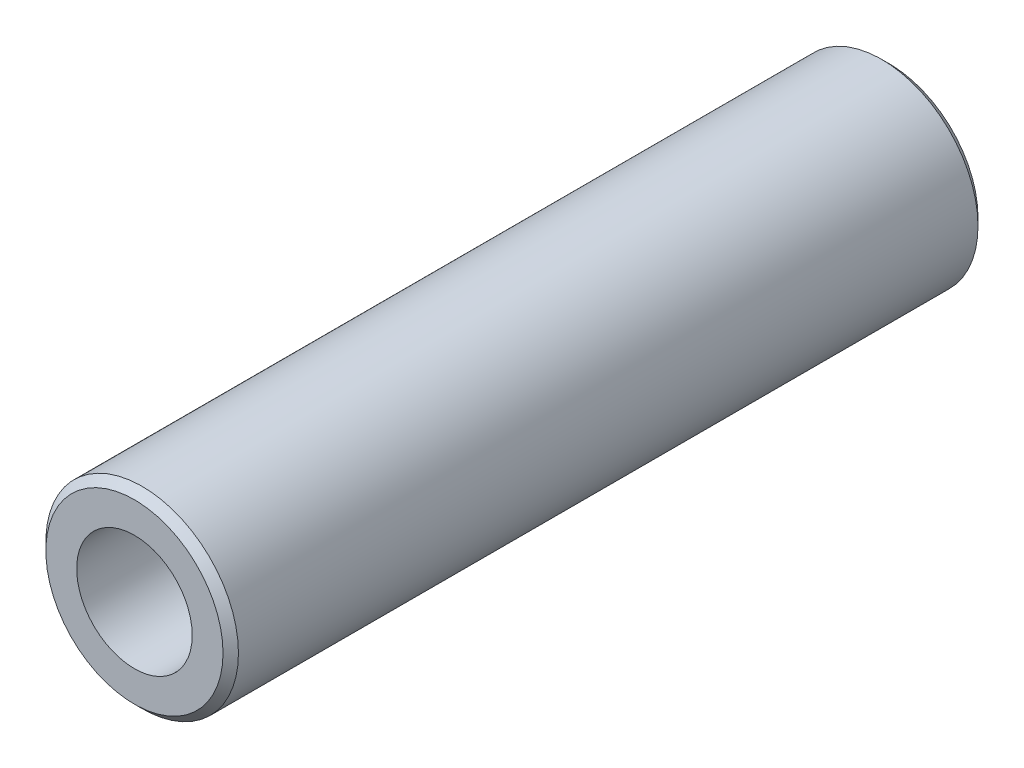
ISO-10303-21;
HEADER;
FILE_DESCRIPTION(('STEP AP214'),'2;1');
FILE_NAME('part.step','',(''),(''),'','','');
FILE_SCHEMA(('AUTOMOTIVE_DESIGN { 1 0 10303 214 1 1 1 1 }'));
ENDSEC;
DATA;
#1=APPLICATION_CONTEXT('core data for automotive mechanical design processes');
#2=APPLICATION_PROTOCOL_DEFINITION('international standard','automotive_design',2000,#1);
#3=PRODUCT_CONTEXT('',#1,'mechanical');
#4=PRODUCT('Part','Part','',(#3));
#5=PRODUCT_RELATED_PRODUCT_CATEGORY('part','',(#4));
#6=PRODUCT_DEFINITION_FORMATION('','',#4);
#7=PRODUCT_DEFINITION_CONTEXT('part definition',#1,'design');
#8=PRODUCT_DEFINITION('design','',#6,#7);
#9=PRODUCT_DEFINITION_SHAPE('','',#8);
#10=(LENGTH_UNIT() NAMED_UNIT(*) SI_UNIT(.MILLI.,.METRE.));
#11=(NAMED_UNIT(*) PLANE_ANGLE_UNIT() SI_UNIT($,.RADIAN.));
#12=(NAMED_UNIT(*) SI_UNIT($,.STERADIAN.) SOLID_ANGLE_UNIT());
#13=UNCERTAINTY_MEASURE_WITH_UNIT(LENGTH_MEASURE(1.E-05),#10,'distance_accuracy_value','');
#14=(GEOMETRIC_REPRESENTATION_CONTEXT(3) GLOBAL_UNCERTAINTY_ASSIGNED_CONTEXT((#13)) GLOBAL_UNIT_ASSIGNED_CONTEXT((#10,
#11,#12)) REPRESENTATION_CONTEXT('',''));
#15=CARTESIAN_POINT('',(0.,0.,0.));
#16=DIRECTION('',(0.,0.,1.));
#17=DIRECTION('',(1.,0.,0.));
#18=AXIS2_PLACEMENT_3D('',#15,#16,#17);
#19=CARTESIAN_POINT('',(0.,0.,24.5));
#20=DIRECTION('',(0.,0.,1.));
#21=DIRECTION('',(1.,0.,0.));
#22=AXIS2_PLACEMENT_3D('',#19,#20,#21);
#23=PLANE('',#22);
#24=CARTESIAN_POINT('',(0.,0.,24.5));
#25=DIRECTION('',(0.,0.,1.));
#26=DIRECTION('',(1.,0.,0.));
#27=AXIS2_PLACEMENT_3D('',#24,#25,#26);
#28=CIRCLE('',#27,5.75);
#29=CARTESIAN_POINT('',(5.75,0.,24.5));
#30=VERTEX_POINT('',#29);
#31=EDGE_CURVE('E11',#30,#30,#28,.T.);
#32=ORIENTED_EDGE('',*,*,#31,.T.);
#33=EDGE_LOOP('',(#32));
#34=FACE_BOUND('',#33,.T.);
#35=CARTESIAN_POINT('',(0.,0.,24.5));
#36=DIRECTION('',(0.,0.,1.));
#37=DIRECTION('',(1.,0.,0.));
#38=AXIS2_PLACEMENT_3D('',#35,#36,#37);
#39=CIRCLE('',#38,3.75);
#40=CARTESIAN_POINT('',(3.75,0.,24.5));
#41=VERTEX_POINT('',#40);
#42=EDGE_CURVE('E64',#41,#41,#39,.T.);
#43=ORIENTED_EDGE('',*,*,#42,.F.);
#44=EDGE_LOOP('',(#43));
#45=FACE_BOUND('',#44,.T.);
#46=ADVANCED_FACE('F43',(#34,#45),#23,.T.);
#47=CARTESIAN_POINT('',(0.,0.,-24.5));
#48=DIRECTION('',(0.,0.,1.));
#49=DIRECTION('',(1.,0.,0.));
#50=AXIS2_PLACEMENT_3D('',#47,#48,#49);
#51=PLANE('',#50);
#52=CARTESIAN_POINT('',(0.,0.,-24.5));
#53=DIRECTION('',(0.,0.,1.));
#54=DIRECTION('',(1.,0.,0.));
#55=AXIS2_PLACEMENT_3D('',#52,#53,#54);
#56=CIRCLE('',#55,5.75);
#57=CARTESIAN_POINT('',(5.75,0.,-24.5));
#58=VERTEX_POINT('',#57);
#59=EDGE_CURVE('E51',#58,#58,#56,.F.);
#60=ORIENTED_EDGE('',*,*,#59,.T.);
#61=EDGE_LOOP('',(#60));
#62=FACE_BOUND('',#61,.T.);
#63=CARTESIAN_POINT('',(0.,0.,-24.5));
#64=DIRECTION('',(0.,0.,1.));
#65=DIRECTION('',(1.,0.,0.));
#66=AXIS2_PLACEMENT_3D('',#63,#64,#65);
#67=CIRCLE('',#66,3.75);
#68=CARTESIAN_POINT('',(3.75,0.,-24.5));
#69=VERTEX_POINT('',#68);
#70=EDGE_CURVE('E65',#69,#69,#67,.T.);
#71=ORIENTED_EDGE('',*,*,#70,.T.);
#72=EDGE_LOOP('',(#71));
#73=FACE_BOUND('',#72,.T.);
#74=ADVANCED_FACE('F75',(#62,#73),#51,.F.);
#75=CARTESIAN_POINT('',(0.,0.,24.5));
#76=DIRECTION('',(0.,0.,-1.));
#77=DIRECTION('',(-1.,0.,0.));
#78=AXIS2_PLACEMENT_3D('',#75,#76,#77);
#79=CYLINDRICAL_SURFACE('',#78,6.25);
#80=CARTESIAN_POINT('',(0.,0.,-24.));
#81=DIRECTION('',(0.,0.,1.));
#82=DIRECTION('',(1.,0.,0.));
#83=AXIS2_PLACEMENT_3D('',#80,#81,#82);
#84=CIRCLE('',#83,6.25);
#85=CARTESIAN_POINT('',(6.25,0.,-24.));
#86=VERTEX_POINT('',#85);
#87=EDGE_CURVE('E55',#86,#86,#84,.T.);
#88=ORIENTED_EDGE('',*,*,#87,.T.);
#89=EDGE_LOOP('',(#88));
#90=FACE_BOUND('',#89,.T.);
#91=CARTESIAN_POINT('',(0.,0.,24.));
#92=DIRECTION('',(0.,0.,1.));
#93=DIRECTION('',(1.,0.,0.));
#94=AXIS2_PLACEMENT_3D('',#91,#92,#93);
#95=CIRCLE('',#94,6.25);
#96=CARTESIAN_POINT('',(6.25,0.,24.));
#97=VERTEX_POINT('',#96);
#98=EDGE_CURVE('E59',#97,#97,#95,.F.);
#99=ORIENTED_EDGE('',*,*,#98,.T.);
#100=EDGE_LOOP('',(#99));
#101=FACE_BOUND('',#100,.T.);
#102=ADVANCED_FACE('F80',(#90,#101),#79,.T.);
#103=CARTESIAN_POINT('',(0.,0.,24.5));
#104=DIRECTION('',(0.,0.,-1.));
#105=DIRECTION('',(-1.,0.,0.));
#106=AXIS2_PLACEMENT_3D('',#103,#104,#105);
#107=CYLINDRICAL_SURFACE('',#106,3.75);
#108=ORIENTED_EDGE('',*,*,#42,.T.);
#109=EDGE_LOOP('',(#108));
#110=FACE_BOUND('',#109,.T.);
#111=ORIENTED_EDGE('',*,*,#70,.F.);
#112=EDGE_LOOP('',(#111));
#113=FACE_BOUND('',#112,.T.);
#114=ADVANCED_FACE('F71',(#110,#113),#107,.F.);
#115=CARTESIAN_POINT('',(0.,0.,-24.));
#116=DIRECTION('',(0.,0.,1.));
#117=DIRECTION('',(1.,0.,0.));
#118=AXIS2_PLACEMENT_3D('',#115,#116,#117);
#119=CONICAL_SURFACE('',#118,6.25,0.785398163397452);
#120=ORIENTED_EDGE('',*,*,#59,.F.);
#121=EDGE_LOOP('',(#120));
#122=FACE_BOUND('',#121,.T.);
#123=ORIENTED_EDGE('',*,*,#87,.F.);
#124=EDGE_LOOP('',(#123));
#125=FACE_BOUND('',#124,.T.);
#126=ADVANCED_FACE('F87',(#122,#125),#119,.T.);
#127=CARTESIAN_POINT('',(0.,0.,24.5));
#128=DIRECTION('',(0.,0.,-1.));
#129=DIRECTION('',(-1.,0.,0.));
#130=AXIS2_PLACEMENT_3D('',#127,#128,#129);
#131=CONICAL_SURFACE('',#130,5.75,0.785398163397448);
#132=ORIENTED_EDGE('',*,*,#98,.F.);
#133=EDGE_LOOP('',(#132));
#134=FACE_BOUND('',#133,.T.);
#135=ORIENTED_EDGE('',*,*,#31,.F.);
#136=EDGE_LOOP('',(#135));
#137=FACE_BOUND('',#136,.T.);
#138=ADVANCED_FACE('F46',(#134,#137),#131,.T.);
#139=CLOSED_SHELL('',(#46,#74,#102,#114,#126,#138));
#140=MANIFOLD_SOLID_BREP('B2',#139);
#141=ADVANCED_BREP_SHAPE_REPRESENTATION('',(#18,#140),#14);
#142=SHAPE_DEFINITION_REPRESENTATION(#9,#141);
ENDSEC;
END-ISO-10303-21;
